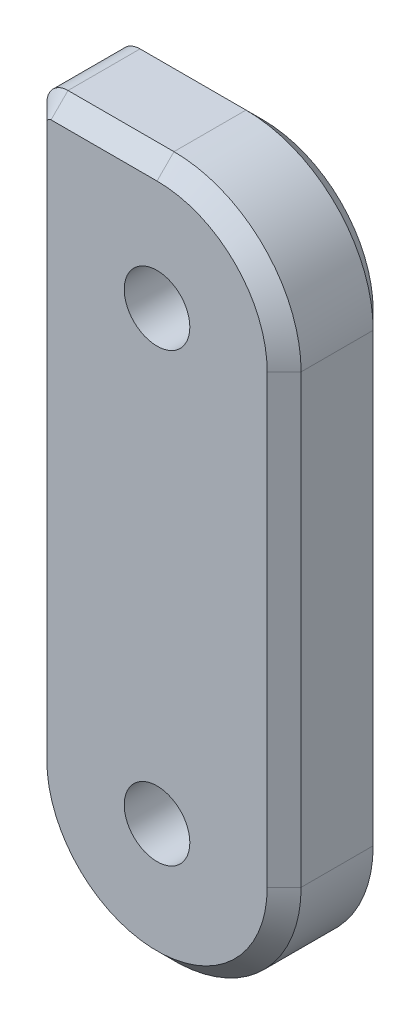
ISO-10303-21;
HEADER;
FILE_DESCRIPTION(('STEP AP214'),'2;1');
FILE_NAME('part.step','',(''),(''),'','','');
FILE_SCHEMA(('AUTOMOTIVE_DESIGN { 1 0 10303 214 1 1 1 1 }'));
ENDSEC;
DATA;
#1=APPLICATION_CONTEXT('core data for automotive mechanical design processes');
#2=APPLICATION_PROTOCOL_DEFINITION('international standard','automotive_design',2000,#1);
#3=PRODUCT_CONTEXT('',#1,'mechanical');
#4=PRODUCT('Part','Part','',(#3));
#5=PRODUCT_RELATED_PRODUCT_CATEGORY('part','',(#4));
#6=PRODUCT_DEFINITION_FORMATION('','',#4);
#7=PRODUCT_DEFINITION_CONTEXT('part definition',#1,'design');
#8=PRODUCT_DEFINITION('design','',#6,#7);
#9=PRODUCT_DEFINITION_SHAPE('','',#8);
#10=(LENGTH_UNIT() NAMED_UNIT(*) SI_UNIT(.MILLI.,.METRE.));
#11=(NAMED_UNIT(*) PLANE_ANGLE_UNIT() SI_UNIT($,.RADIAN.));
#12=(NAMED_UNIT(*) SI_UNIT($,.STERADIAN.) SOLID_ANGLE_UNIT());
#13=UNCERTAINTY_MEASURE_WITH_UNIT(LENGTH_MEASURE(1.E-05),#10,'distance_accuracy_value','');
#14=(GEOMETRIC_REPRESENTATION_CONTEXT(3) GLOBAL_UNCERTAINTY_ASSIGNED_CONTEXT((#13)) GLOBAL_UNIT_ASSIGNED_CONTEXT((#10,
#11,#12)) REPRESENTATION_CONTEXT('',''));
#15=CARTESIAN_POINT('',(0.,0.,0.));
#16=DIRECTION('',(0.,0.,1.));
#17=DIRECTION('',(1.,0.,0.));
#18=AXIS2_PLACEMENT_3D('',#15,#16,#17);
#19=CARTESIAN_POINT('',(0.,33.44418,7.9375));
#20=DIRECTION('',(0.,0.,1.));
#21=DIRECTION('',(1.,0.,0.));
#22=AXIS2_PLACEMENT_3D('',#19,#20,#21);
#23=CYLINDRICAL_SURFACE('',#22,2.45744999999999);
#24=CARTESIAN_POINT('',(0.,33.44418,7.9375));
#25=DIRECTION('',(0.,0.,1.));
#26=DIRECTION('',(1.,0.,0.));
#27=AXIS2_PLACEMENT_3D('',#24,#25,#26);
#28=CIRCLE('',#27,2.45744999999999);
#29=CARTESIAN_POINT('',(2.45744999999999,33.44418,7.9375));
#30=VERTEX_POINT('',#29);
#31=EDGE_CURVE('E213',#30,#30,#28,.T.);
#32=ORIENTED_EDGE('',*,*,#31,.T.);
#33=EDGE_LOOP('',(#32));
#34=FACE_BOUND('',#33,.T.);
#35=CARTESIAN_POINT('',(0.,33.44418,2.032));
#36=DIRECTION('',(0.,0.,-1.));
#37=DIRECTION('',(-1.,0.,0.));
#38=AXIS2_PLACEMENT_3D('',#35,#36,#37);
#39=CIRCLE('',#38,2.45744999999999);
#40=CARTESIAN_POINT('',(-2.45744999999999,33.44418,2.032));
#41=VERTEX_POINT('',#40);
#42=EDGE_CURVE('E210',#41,#41,#39,.F.);
#43=ORIENTED_EDGE('',*,*,#42,.F.);
#44=EDGE_LOOP('',(#43));
#45=FACE_BOUND('',#44,.T.);
#46=ADVANCED_FACE('F33',(#34,#45),#23,.F.);
#47=CARTESIAN_POINT('',(0.,0.,7.9375));
#48=DIRECTION('',(0.,0.,-1.));
#49=DIRECTION('',(-1.,0.,0.));
#50=AXIS2_PLACEMENT_3D('',#47,#48,#49);
#51=CYLINDRICAL_SURFACE('',#50,9.525);
#52=DIRECTION('',(0.,0.,-1.));
#53=VECTOR('',#52,1.);
#54=CARTESIAN_POINT('',(-9.525,0.,7.9375));
#55=LINE('',#54,#53);
#56=CARTESIAN_POINT('',(-9.525,0.,6.6675));
#57=VERTEX_POINT('',#56);
#58=CARTESIAN_POINT('',(-9.525,0.,1.27000000000001));
#59=VERTEX_POINT('',#58);
#60=EDGE_CURVE('E149',#57,#59,#55,.T.);
#61=ORIENTED_EDGE('',*,*,#60,.T.);
#62=CARTESIAN_POINT('',(0.,0.,1.27000000000001));
#63=DIRECTION('',(0.,0.,1.));
#64=DIRECTION('',(1.,0.,0.));
#65=AXIS2_PLACEMENT_3D('',#62,#63,#64);
#66=CIRCLE('',#65,9.525);
#67=CARTESIAN_POINT('',(9.525,0.,1.27000000000001));
#68=VERTEX_POINT('',#67);
#69=EDGE_CURVE('E258',#59,#68,#66,.T.);
#70=ORIENTED_EDGE('',*,*,#69,.T.);
#71=DIRECTION('',(0.,0.,-1.));
#72=VECTOR('',#71,1.);
#73=CARTESIAN_POINT('',(9.525,0.,7.9375));
#74=LINE('',#73,#72);
#75=CARTESIAN_POINT('',(9.525,0.,6.6675));
#76=VERTEX_POINT('',#75);
#77=EDGE_CURVE('E225',#76,#68,#74,.T.);
#78=ORIENTED_EDGE('',*,*,#77,.F.);
#79=CARTESIAN_POINT('',(0.,0.,6.6675));
#80=DIRECTION('',(0.,0.,1.));
#81=DIRECTION('',(1.,0.,0.));
#82=AXIS2_PLACEMENT_3D('',#79,#80,#81);
#83=CIRCLE('',#82,9.525);
#84=EDGE_CURVE('E256',#76,#57,#83,.F.);
#85=ORIENTED_EDGE('',*,*,#84,.T.);
#86=EDGE_LOOP('',(#61,#70,#78,#85));
#87=FACE_BOUND('',#86,.T.);
#88=ADVANCED_FACE('F290',(#87),#51,.T.);
#89=CARTESIAN_POINT('',(9.525,33.44418,7.9375));
#90=DIRECTION('',(-1.,0.,0.));
#91=DIRECTION('',(0.,0.,1.));
#92=AXIS2_PLACEMENT_3D('',#89,#90,#91);
#93=PLANE('',#92);
#94=ORIENTED_EDGE('',*,*,#77,.T.);
#95=DIRECTION('',(0.,1.,0.));
#96=VECTOR('',#95,1.);
#97=CARTESIAN_POINT('',(9.525,33.44418,1.27000000000001));
#98=LINE('',#97,#96);
#99=CARTESIAN_POINT('',(9.525,33.44418,1.27000000000001));
#100=VERTEX_POINT('',#99);
#101=EDGE_CURVE('E250',#68,#100,#98,.T.);
#102=ORIENTED_EDGE('',*,*,#101,.T.);
#103=DIRECTION('',(0.,0.,-1.));
#104=VECTOR('',#103,1.);
#105=CARTESIAN_POINT('',(9.525,33.44418,7.9375));
#106=LINE('',#105,#104);
#107=CARTESIAN_POINT('',(9.525,33.44418,6.6675));
#108=VERTEX_POINT('',#107);
#109=EDGE_CURVE('E148',#108,#100,#106,.T.);
#110=ORIENTED_EDGE('',*,*,#109,.F.);
#111=DIRECTION('',(0.,-1.,0.));
#112=VECTOR('',#111,1.);
#113=CARTESIAN_POINT('',(9.525,0.,6.6675));
#114=LINE('',#113,#112);
#115=EDGE_CURVE('E248',#108,#76,#114,.T.);
#116=ORIENTED_EDGE('',*,*,#115,.T.);
#117=EDGE_LOOP('',(#94,#102,#110,#116));
#118=FACE_BOUND('',#117,.T.);
#119=ADVANCED_FACE('F287',(#118),#93,.F.);
#120=CARTESIAN_POINT('',(0.,33.44418,7.9375));
#121=DIRECTION('',(0.,0.,-1.));
#122=DIRECTION('',(-1.,0.,0.));
#123=AXIS2_PLACEMENT_3D('',#120,#121,#122);
#124=CYLINDRICAL_SURFACE('',#123,9.525);
#125=ORIENTED_EDGE('',*,*,#109,.T.);
#126=CARTESIAN_POINT('',(0.,33.44418,1.27000000000001));
#127=DIRECTION('',(0.,0.,1.));
#128=DIRECTION('',(1.,0.,0.));
#129=AXIS2_PLACEMENT_3D('',#126,#127,#128);
#130=CIRCLE('',#129,9.525);
#131=CARTESIAN_POINT('',(0.,42.96918,1.27000000000001));
#132=VERTEX_POINT('',#131);
#133=EDGE_CURVE('E147',#100,#132,#130,.T.);
#134=ORIENTED_EDGE('',*,*,#133,.T.);
#135=DIRECTION('',(0.,0.,-1.));
#136=VECTOR('',#135,1.);
#137=CARTESIAN_POINT('',(0.,42.96918,7.9375));
#138=LINE('',#137,#136);
#139=CARTESIAN_POINT('',(0.,42.96918,6.6675));
#140=VERTEX_POINT('',#139);
#141=EDGE_CURVE('E130',#140,#132,#138,.T.);
#142=ORIENTED_EDGE('',*,*,#141,.F.);
#143=CARTESIAN_POINT('',(0.,33.44418,6.6675));
#144=DIRECTION('',(0.,0.,1.));
#145=DIRECTION('',(1.,0.,0.));
#146=AXIS2_PLACEMENT_3D('',#143,#144,#145);
#147=CIRCLE('',#146,9.525);
#148=EDGE_CURVE('E144',#140,#108,#147,.F.);
#149=ORIENTED_EDGE('',*,*,#148,.T.);
#150=EDGE_LOOP('',(#125,#134,#142,#149));
#151=FACE_BOUND('',#150,.T.);
#152=ADVANCED_FACE('F143',(#151),#124,.T.);
#153=CARTESIAN_POINT('',(-9.525,42.96918,7.9375));
#154=DIRECTION('',(0.,-1.,0.));
#155=DIRECTION('',(0.,0.,-1.));
#156=AXIS2_PLACEMENT_3D('',#153,#154,#155);
#157=PLANE('',#156);
#158=ORIENTED_EDGE('',*,*,#141,.T.);
#159=DIRECTION('',(-1.,0.,0.));
#160=VECTOR('',#159,1.);
#161=CARTESIAN_POINT('',(-9.525,42.96918,1.27000000000001));
#162=LINE('',#161,#160);
#163=CARTESIAN_POINT('',(-7.9375,42.96918,1.27000000000001));
#164=VERTEX_POINT('',#163);
#165=EDGE_CURVE('E136',#132,#164,#162,.T.);
#166=ORIENTED_EDGE('',*,*,#165,.T.);
#167=DIRECTION('',(0.,0.,-1.));
#168=VECTOR('',#167,1.);
#169=CARTESIAN_POINT('',(-7.9375,42.96918,7.9375));
#170=LINE('',#169,#168);
#171=CARTESIAN_POINT('',(-7.9375,42.96918,6.6675));
#172=VERTEX_POINT('',#171);
#173=EDGE_CURVE('E132',#164,#172,#170,.F.);
#174=ORIENTED_EDGE('',*,*,#173,.T.);
#175=DIRECTION('',(1.,0.,0.));
#176=VECTOR('',#175,1.);
#177=CARTESIAN_POINT('',(0.,42.96918,6.6675));
#178=LINE('',#177,#176);
#179=EDGE_CURVE('E127',#172,#140,#178,.T.);
#180=ORIENTED_EDGE('',*,*,#179,.T.);
#181=EDGE_LOOP('',(#158,#166,#174,#180));
#182=FACE_BOUND('',#181,.T.);
#183=ADVANCED_FACE('F129',(#182),#157,.F.);
#184=CARTESIAN_POINT('',(-9.525,42.96918,7.9375));
#185=DIRECTION('',(1.,0.,0.));
#186=DIRECTION('',(0.,0.,-1.));
#187=AXIS2_PLACEMENT_3D('',#184,#185,#186);
#188=PLANE('',#187);
#189=DIRECTION('',(0.,0.,-1.));
#190=VECTOR('',#189,1.);
#191=CARTESIAN_POINT('',(-9.525,41.38168,7.9375));
#192=LINE('',#191,#190);
#193=CARTESIAN_POINT('',(-9.525,41.38168,6.6675));
#194=VERTEX_POINT('',#193);
#195=CARTESIAN_POINT('',(-9.525,41.38168,1.27000000000001));
#196=VERTEX_POINT('',#195);
#197=EDGE_CURVE('E228',#194,#196,#192,.T.);
#198=ORIENTED_EDGE('',*,*,#197,.T.);
#199=DIRECTION('',(0.,-1.,0.));
#200=VECTOR('',#199,1.);
#201=CARTESIAN_POINT('',(-9.525,42.96918,1.27000000000001));
#202=LINE('',#201,#200);
#203=EDGE_CURVE('E262',#196,#59,#202,.T.);
#204=ORIENTED_EDGE('',*,*,#203,.T.);
#205=ORIENTED_EDGE('',*,*,#60,.F.);
#206=DIRECTION('',(0.,1.,0.));
#207=VECTOR('',#206,1.);
#208=CARTESIAN_POINT('',(-9.525,41.38168,6.6675));
#209=LINE('',#208,#207);
#210=EDGE_CURVE('E260',#57,#194,#209,.T.);
#211=ORIENTED_EDGE('',*,*,#210,.T.);
#212=EDGE_LOOP('',(#198,#204,#205,#211));
#213=FACE_BOUND('',#212,.T.);
#214=ADVANCED_FACE('F329',(#213),#188,.F.);
#215=CARTESIAN_POINT('',(0.,0.,7.9375));
#216=DIRECTION('',(0.,0.,1.));
#217=DIRECTION('',(1.,0.,0.));
#218=AXIS2_PLACEMENT_3D('',#215,#216,#217);
#219=PLANE('',#218);
#220=DIRECTION('',(0.,1.,0.));
#221=VECTOR('',#220,1.);
#222=CARTESIAN_POINT('',(8.25500000000001,33.44418,7.9375));
#223=LINE('',#222,#221);
#224=CARTESIAN_POINT('',(8.25500000000001,0.,7.9375));
#225=VERTEX_POINT('',#224);
#226=CARTESIAN_POINT('',(8.25500000000001,33.44418,7.9375));
#227=VERTEX_POINT('',#226);
#228=EDGE_CURVE('E57',#225,#227,#223,.T.);
#229=ORIENTED_EDGE('',*,*,#228,.T.);
#230=CARTESIAN_POINT('',(0.,33.44418,7.9375));
#231=DIRECTION('',(0.,0.,1.));
#232=DIRECTION('',(1.,0.,0.));
#233=AXIS2_PLACEMENT_3D('',#230,#231,#232);
#234=CIRCLE('',#233,8.25500000000001);
#235=CARTESIAN_POINT('',(0.,41.69918,7.9375));
#236=VERTEX_POINT('',#235);
#237=EDGE_CURVE('E11',#227,#236,#234,.T.);
#238=ORIENTED_EDGE('',*,*,#237,.T.);
#239=DIRECTION('',(-1.,0.,0.));
#240=VECTOR('',#239,1.);
#241=CARTESIAN_POINT('',(-7.9375,41.69918,7.9375));
#242=LINE('',#241,#240);
#243=CARTESIAN_POINT('',(-7.9375,41.69918,7.9375));
#244=VERTEX_POINT('',#243);
#245=EDGE_CURVE('E42',#236,#244,#242,.T.);
#246=ORIENTED_EDGE('',*,*,#245,.T.);
#247=CARTESIAN_POINT('',(-7.9375,41.38168,7.9375));
#248=DIRECTION('',(0.,0.,1.));
#249=DIRECTION('',(1.,0.,0.));
#250=AXIS2_PLACEMENT_3D('',#247,#248,#249);
#251=CIRCLE('',#250,0.317500000000005);
#252=CARTESIAN_POINT('',(-8.25500000000001,41.38168,7.9375));
#253=VERTEX_POINT('',#252);
#254=EDGE_CURVE('E268',#244,#253,#251,.T.);
#255=ORIENTED_EDGE('',*,*,#254,.T.);
#256=DIRECTION('',(0.,-1.,0.));
#257=VECTOR('',#256,1.);
#258=CARTESIAN_POINT('',(-8.25500000000001,0.,7.9375));
#259=LINE('',#258,#257);
#260=CARTESIAN_POINT('',(-8.25500000000001,0.,7.9375));
#261=VERTEX_POINT('',#260);
#262=EDGE_CURVE('E264',#253,#261,#259,.T.);
#263=ORIENTED_EDGE('',*,*,#262,.T.);
#264=CARTESIAN_POINT('',(0.,0.,7.9375));
#265=DIRECTION('',(0.,0.,1.));
#266=DIRECTION('',(1.,0.,0.));
#267=AXIS2_PLACEMENT_3D('',#264,#265,#266);
#268=CIRCLE('',#267,8.25500000000001);
#269=EDGE_CURVE('E266',#261,#225,#268,.T.);
#270=ORIENTED_EDGE('',*,*,#269,.T.);
#271=EDGE_LOOP('',(#229,#238,#246,#255,#263,#270));
#272=FACE_BOUND('',#271,.T.);
#273=ORIENTED_EDGE('',*,*,#31,.F.);
#274=EDGE_LOOP('',(#273));
#275=FACE_BOUND('',#274,.T.);
#276=CARTESIAN_POINT('',(0.,0.,7.9375));
#277=DIRECTION('',(0.,0.,1.));
#278=DIRECTION('',(1.,0.,0.));
#279=AXIS2_PLACEMENT_3D('',#276,#277,#278);
#280=CIRCLE('',#279,2.45744999999999);
#281=CARTESIAN_POINT('',(2.45745000000004,0.,7.9375));
#282=VERTEX_POINT('',#281);
#283=EDGE_CURVE('E216',#282,#282,#280,.T.);
#284=ORIENTED_EDGE('',*,*,#283,.F.);
#285=EDGE_LOOP('',(#284));
#286=FACE_BOUND('',#285,.T.);
#287=ADVANCED_FACE('F270',(#272,#275,#286),#219,.T.);
#288=CARTESIAN_POINT('',(0.,0.,0.));
#289=DIRECTION('',(0.,0.,1.));
#290=DIRECTION('',(1.,0.,0.));
#291=AXIS2_PLACEMENT_3D('',#288,#289,#290);
#292=PLANE('',#291);
#293=DIRECTION('',(1.,0.,0.));
#294=VECTOR('',#293,1.);
#295=CARTESIAN_POINT('',(0.,41.69918,0.));
#296=LINE('',#295,#294);
#297=CARTESIAN_POINT('',(-7.9375,41.69918,0.));
#298=VERTEX_POINT('',#297);
#299=CARTESIAN_POINT('',(0.,41.69918,0.));
#300=VERTEX_POINT('',#299);
#301=EDGE_CURVE('E243',#298,#300,#296,.T.);
#302=ORIENTED_EDGE('',*,*,#301,.T.);
#303=CARTESIAN_POINT('',(0.,33.44418,0.));
#304=DIRECTION('',(0.,0.,1.));
#305=DIRECTION('',(1.,0.,0.));
#306=AXIS2_PLACEMENT_3D('',#303,#304,#305);
#307=CIRCLE('',#306,8.25499999999999);
#308=CARTESIAN_POINT('',(8.255,33.44418,0.));
#309=VERTEX_POINT('',#308);
#310=EDGE_CURVE('E137',#300,#309,#307,.F.);
#311=ORIENTED_EDGE('',*,*,#310,.T.);
#312=DIRECTION('',(0.,-1.,0.));
#313=VECTOR('',#312,1.);
#314=CARTESIAN_POINT('',(8.255,0.,0.));
#315=LINE('',#314,#313);
#316=CARTESIAN_POINT('',(8.255,0.,0.));
#317=VERTEX_POINT('',#316);
#318=EDGE_CURVE('E241',#309,#317,#315,.T.);
#319=ORIENTED_EDGE('',*,*,#318,.T.);
#320=CARTESIAN_POINT('',(0.,0.,0.));
#321=DIRECTION('',(0.,0.,1.));
#322=DIRECTION('',(1.,0.,0.));
#323=AXIS2_PLACEMENT_3D('',#320,#321,#322);
#324=CIRCLE('',#323,8.255);
#325=CARTESIAN_POINT('',(-8.255,0.,0.));
#326=VERTEX_POINT('',#325);
#327=EDGE_CURVE('E237',#317,#326,#324,.F.);
#328=ORIENTED_EDGE('',*,*,#327,.T.);
#329=DIRECTION('',(0.,1.,0.));
#330=VECTOR('',#329,1.);
#331=CARTESIAN_POINT('',(-8.255,0.,0.));
#332=LINE('',#331,#330);
#333=CARTESIAN_POINT('',(-8.255,41.38168,0.));
#334=VERTEX_POINT('',#333);
#335=EDGE_CURVE('E235',#326,#334,#332,.T.);
#336=ORIENTED_EDGE('',*,*,#335,.T.);
#337=CARTESIAN_POINT('',(-7.9375,41.38168,0.));
#338=DIRECTION('',(0.,0.,1.));
#339=DIRECTION('',(1.,0.,0.));
#340=AXIS2_PLACEMENT_3D('',#337,#338,#339);
#341=CIRCLE('',#340,0.317499999999991);
#342=EDGE_CURVE('E239',#334,#298,#341,.F.);
#343=ORIENTED_EDGE('',*,*,#342,.T.);
#344=EDGE_LOOP('',(#302,#311,#319,#328,#336,#343));
#345=FACE_BOUND('',#344,.T.);
#346=CARTESIAN_POINT('',(0.,33.44418,0.));
#347=DIRECTION('',(0.,0.,-1.));
#348=DIRECTION('',(-1.,0.,0.));
#349=AXIS2_PLACEMENT_3D('',#346,#347,#348);
#350=CIRCLE('',#349,5.08);
#351=CARTESIAN_POINT('',(-5.08,33.44418,0.));
#352=VERTEX_POINT('',#351);
#353=EDGE_CURVE('E199',#352,#352,#350,.T.);
#354=ORIENTED_EDGE('',*,*,#353,.F.);
#355=EDGE_LOOP('',(#354));
#356=FACE_BOUND('',#355,.T.);
#357=CARTESIAN_POINT('',(0.,0.,0.));
#358=DIRECTION('',(0.,0.,1.));
#359=DIRECTION('',(1.,0.,0.));
#360=AXIS2_PLACEMENT_3D('',#357,#358,#359);
#361=CIRCLE('',#360,2.45744999999999);
#362=CARTESIAN_POINT('',(2.45745000000005,0.,0.));
#363=VERTEX_POINT('',#362);
#364=EDGE_CURVE('E219',#363,#363,#361,.T.);
#365=ORIENTED_EDGE('',*,*,#364,.T.);
#366=EDGE_LOOP('',(#365));
#367=FACE_BOUND('',#366,.T.);
#368=ADVANCED_FACE('F325',(#345,#356,#367),#292,.F.);
#369=CARTESIAN_POINT('',(0.,0.,7.9375));
#370=DIRECTION('',(0.,0.,1.));
#371=DIRECTION('',(1.,0.,0.));
#372=AXIS2_PLACEMENT_3D('',#369,#370,#371);
#373=CYLINDRICAL_SURFACE('',#372,2.45744999999999);
#374=ORIENTED_EDGE('',*,*,#364,.F.);
#375=EDGE_LOOP('',(#374));
#376=FACE_BOUND('',#375,.T.);
#377=ORIENTED_EDGE('',*,*,#283,.T.);
#378=EDGE_LOOP('',(#377));
#379=FACE_BOUND('',#378,.T.);
#380=ADVANCED_FACE('F321',(#376,#379),#373,.F.);
#381=CARTESIAN_POINT('',(0.,33.44418,2.032));
#382=DIRECTION('',(0.,0.,-1.));
#383=DIRECTION('',(-1.,0.,0.));
#384=AXIS2_PLACEMENT_3D('',#381,#382,#383);
#385=PLANE('',#384);
#386=CARTESIAN_POINT('',(0.,33.44418,2.032));
#387=DIRECTION('',(0.,0.,-1.));
#388=DIRECTION('',(-1.,0.,0.));
#389=AXIS2_PLACEMENT_3D('',#386,#387,#388);
#390=CIRCLE('',#389,5.08);
#391=CARTESIAN_POINT('',(-5.08,33.44418,2.032));
#392=VERTEX_POINT('',#391);
#393=EDGE_CURVE('E205',#392,#392,#390,.T.);
#394=ORIENTED_EDGE('',*,*,#393,.T.);
#395=EDGE_LOOP('',(#394));
#396=FACE_BOUND('',#395,.T.);
#397=ORIENTED_EDGE('',*,*,#42,.T.);
#398=EDGE_LOOP('',(#397));
#399=FACE_BOUND('',#398,.T.);
#400=ADVANCED_FACE('F324',(#396,#399),#385,.T.);
#401=CARTESIAN_POINT('',(0.,33.44418,2.032));
#402=DIRECTION('',(0.,0.,-1.));
#403=DIRECTION('',(-1.,0.,0.));
#404=AXIS2_PLACEMENT_3D('',#401,#402,#403);
#405=CYLINDRICAL_SURFACE('',#404,5.08);
#406=ORIENTED_EDGE('',*,*,#393,.F.);
#407=EDGE_LOOP('',(#406));
#408=FACE_BOUND('',#407,.T.);
#409=ORIENTED_EDGE('',*,*,#353,.T.);
#410=EDGE_LOOP('',(#409));
#411=FACE_BOUND('',#410,.T.);
#412=ADVANCED_FACE('F319',(#408,#411),#405,.F.);
#413=CARTESIAN_POINT('',(-7.9375,41.38168,7.9375));
#414=DIRECTION('',(0.,0.,-1.));
#415=DIRECTION('',(-1.,0.,0.));
#416=AXIS2_PLACEMENT_3D('',#413,#414,#415);
#417=CYLINDRICAL_SURFACE('',#416,1.5875);
#418=ORIENTED_EDGE('',*,*,#173,.F.);
#419=CARTESIAN_POINT('',(-7.9375,41.38168,1.27000000000001));
#420=DIRECTION('',(0.,0.,1.));
#421=DIRECTION('',(1.,0.,0.));
#422=AXIS2_PLACEMENT_3D('',#419,#420,#421);
#423=CIRCLE('',#422,1.5875);
#424=EDGE_CURVE('E254',#164,#196,#423,.T.);
#425=ORIENTED_EDGE('',*,*,#424,.T.);
#426=ORIENTED_EDGE('',*,*,#197,.F.);
#427=CARTESIAN_POINT('',(-7.9375,41.38168,6.6675));
#428=DIRECTION('',(0.,0.,1.));
#429=DIRECTION('',(1.,0.,0.));
#430=AXIS2_PLACEMENT_3D('',#427,#428,#429);
#431=CIRCLE('',#430,1.5875);
#432=EDGE_CURVE('E252',#194,#172,#431,.F.);
#433=ORIENTED_EDGE('',*,*,#432,.T.);
#434=EDGE_LOOP('',(#418,#425,#426,#433));
#435=FACE_BOUND('',#434,.T.);
#436=ADVANCED_FACE('F276',(#435),#417,.T.);
#437=CARTESIAN_POINT('',(-9.525,42.96918,1.27000000000001));
#438=DIRECTION('',(0.707106781186547,0.,0.707106781186547));
#439=DIRECTION('',(0.,-1.,0.));
#440=AXIS2_PLACEMENT_3D('',#437,#438,#439);
#441=PLANE('',#440);
#442=DIRECTION('',(-0.707106781186547,0.,0.707106781186547));
#443=VECTOR('',#442,1.);
#444=CARTESIAN_POINT('',(-8.255,41.38168,0.));
#445=LINE('',#444,#443);
#446=EDGE_CURVE('E192',#334,#196,#445,.T.);
#447=ORIENTED_EDGE('',*,*,#446,.F.);
#448=ORIENTED_EDGE('',*,*,#335,.F.);
#449=DIRECTION('',(0.707106781186547,0.,-0.707106781186547));
#450=VECTOR('',#449,1.);
#451=CARTESIAN_POINT('',(-9.525,0.,1.27000000000001));
#452=LINE('',#451,#450);
#453=EDGE_CURVE('E160',#59,#326,#452,.T.);
#454=ORIENTED_EDGE('',*,*,#453,.F.);
#455=ORIENTED_EDGE('',*,*,#203,.F.);
#456=EDGE_LOOP('',(#447,#448,#454,#455));
#457=FACE_BOUND('',#456,.T.);
#458=ADVANCED_FACE('F341',(#457),#441,.F.);
#459=CARTESIAN_POINT('',(0.,0.,1.27000000000001));
#460=DIRECTION('',(0.,0.,1.));
#461=DIRECTION('',(1.,0.,0.));
#462=AXIS2_PLACEMENT_3D('',#459,#460,#461);
#463=CONICAL_SURFACE('',#462,9.525,0.785398163397448);
#464=ORIENTED_EDGE('',*,*,#453,.T.);
#465=ORIENTED_EDGE('',*,*,#327,.F.);
#466=DIRECTION('',(-0.707106781186547,0.,-0.707106781186547));
#467=VECTOR('',#466,1.);
#468=CARTESIAN_POINT('',(9.525,0.,1.27000000000001));
#469=LINE('',#468,#467);
#470=EDGE_CURVE('E190',#68,#317,#469,.T.);
#471=ORIENTED_EDGE('',*,*,#470,.F.);
#472=ORIENTED_EDGE('',*,*,#69,.F.);
#473=EDGE_LOOP('',(#464,#465,#471,#472));
#474=FACE_BOUND('',#473,.T.);
#475=ADVANCED_FACE('F292',(#474),#463,.T.);
#476=CARTESIAN_POINT('',(-7.9375,41.38168,0.));
#477=DIRECTION('',(0.,0.,1.));
#478=DIRECTION('',(1.,0.,0.));
#479=AXIS2_PLACEMENT_3D('',#476,#477,#478);
#480=CONICAL_SURFACE('',#479,0.317499999999991,0.785398163397449);
#481=ORIENTED_EDGE('',*,*,#446,.T.);
#482=ORIENTED_EDGE('',*,*,#424,.F.);
#483=DIRECTION('',(0.,0.707106781186547,0.707106781186547));
#484=VECTOR('',#483,1.);
#485=CARTESIAN_POINT('',(-7.9375,41.69918,0.));
#486=LINE('',#485,#484);
#487=EDGE_CURVE('E184',#298,#164,#486,.T.);
#488=ORIENTED_EDGE('',*,*,#487,.F.);
#489=ORIENTED_EDGE('',*,*,#342,.F.);
#490=EDGE_LOOP('',(#481,#482,#488,#489));
#491=FACE_BOUND('',#490,.T.);
#492=ADVANCED_FACE('F416',(#491),#480,.T.);
#493=CARTESIAN_POINT('',(9.525,33.44418,1.27000000000001));
#494=DIRECTION('',(-0.707106781186547,0.,0.707106781186547));
#495=DIRECTION('',(0.,1.,0.));
#496=AXIS2_PLACEMENT_3D('',#493,#494,#495);
#497=PLANE('',#496);
#498=ORIENTED_EDGE('',*,*,#470,.T.);
#499=ORIENTED_EDGE('',*,*,#318,.F.);
#500=DIRECTION('',(-0.707106781186547,0.,-0.707106781186547));
#501=VECTOR('',#500,1.);
#502=CARTESIAN_POINT('',(9.525,33.44418,1.27000000000001));
#503=LINE('',#502,#501);
#504=EDGE_CURVE('E178',#100,#309,#503,.T.);
#505=ORIENTED_EDGE('',*,*,#504,.F.);
#506=ORIENTED_EDGE('',*,*,#101,.F.);
#507=EDGE_LOOP('',(#498,#499,#505,#506));
#508=FACE_BOUND('',#507,.T.);
#509=ADVANCED_FACE('F297',(#508),#497,.F.);
#510=CARTESIAN_POINT('',(-9.525,42.96918,1.27000000000001));
#511=DIRECTION('',(0.,-0.707106781186547,0.707106781186547));
#512=DIRECTION('',(-1.,0.,0.));
#513=AXIS2_PLACEMENT_3D('',#510,#511,#512);
#514=PLANE('',#513);
#515=ORIENTED_EDGE('',*,*,#487,.T.);
#516=ORIENTED_EDGE('',*,*,#165,.F.);
#517=DIRECTION('',(0.,0.707106781186547,0.707106781186547));
#518=VECTOR('',#517,1.);
#519=CARTESIAN_POINT('',(0.,41.69918,0.));
#520=LINE('',#519,#518);
#521=EDGE_CURVE('E173',#300,#132,#520,.T.);
#522=ORIENTED_EDGE('',*,*,#521,.F.);
#523=ORIENTED_EDGE('',*,*,#301,.F.);
#524=EDGE_LOOP('',(#515,#516,#522,#523));
#525=FACE_BOUND('',#524,.T.);
#526=ADVANCED_FACE('F300',(#525),#514,.F.);
#527=CARTESIAN_POINT('',(0.,33.44418,1.27000000000001));
#528=DIRECTION('',(0.,0.,1.));
#529=DIRECTION('',(1.,0.,0.));
#530=AXIS2_PLACEMENT_3D('',#527,#528,#529);
#531=CONICAL_SURFACE('',#530,9.525,0.785398163397448);
#532=ORIENTED_EDGE('',*,*,#504,.T.);
#533=ORIENTED_EDGE('',*,*,#310,.F.);
#534=ORIENTED_EDGE('',*,*,#521,.T.);
#535=ORIENTED_EDGE('',*,*,#133,.F.);
#536=EDGE_LOOP('',(#532,#533,#534,#535));
#537=FACE_BOUND('',#536,.T.);
#538=ADVANCED_FACE('F298',(#537),#531,.T.);
#539=CARTESIAN_POINT('',(-8.25500000000001,0.,7.9375));
#540=DIRECTION('',(-0.707106781186549,0.,0.707106781186546));
#541=DIRECTION('',(0.,1.,0.));
#542=AXIS2_PLACEMENT_3D('',#539,#540,#541);
#543=PLANE('',#542);
#544=DIRECTION('',(0.707106781186546,0.,0.707106781186549));
#545=VECTOR('',#544,1.);
#546=CARTESIAN_POINT('',(-9.525,41.38168,6.6675));
#547=LINE('',#546,#545);
#548=EDGE_CURVE('E166',#194,#253,#547,.T.);
#549=ORIENTED_EDGE('',*,*,#548,.F.);
#550=ORIENTED_EDGE('',*,*,#210,.F.);
#551=DIRECTION('',(-0.707106781186546,0.,-0.707106781186549));
#552=VECTOR('',#551,1.);
#553=CARTESIAN_POINT('',(-8.25500000000001,0.,7.9375));
#554=LINE('',#553,#552);
#555=EDGE_CURVE('E37',#261,#57,#554,.T.);
#556=ORIENTED_EDGE('',*,*,#555,.F.);
#557=ORIENTED_EDGE('',*,*,#262,.F.);
#558=EDGE_LOOP('',(#549,#550,#556,#557));
#559=FACE_BOUND('',#558,.T.);
#560=ADVANCED_FACE('F35',(#559),#543,.T.);
#561=CARTESIAN_POINT('',(0.,0.,7.9375));
#562=DIRECTION('',(0.,0.,-1.));
#563=DIRECTION('',(-1.,0.,0.));
#564=AXIS2_PLACEMENT_3D('',#561,#562,#563);
#565=CONICAL_SURFACE('',#564,8.25500000000001,0.785398163397446);
#566=ORIENTED_EDGE('',*,*,#555,.T.);
#567=ORIENTED_EDGE('',*,*,#84,.F.);
#568=DIRECTION('',(0.707106781186546,0.,-0.707106781186549));
#569=VECTOR('',#568,1.);
#570=CARTESIAN_POINT('',(8.25500000000001,0.,7.9375));
#571=LINE('',#570,#569);
#572=EDGE_CURVE('E164',#225,#76,#571,.T.);
#573=ORIENTED_EDGE('',*,*,#572,.F.);
#574=ORIENTED_EDGE('',*,*,#269,.F.);
#575=EDGE_LOOP('',(#566,#567,#573,#574));
#576=FACE_BOUND('',#575,.T.);
#577=ADVANCED_FACE('F282',(#576),#565,.T.);
#578=CARTESIAN_POINT('',(-7.9375,41.38168,7.9375));
#579=DIRECTION('',(0.,0.,-1.));
#580=DIRECTION('',(-1.,0.,0.));
#581=AXIS2_PLACEMENT_3D('',#578,#579,#580);
#582=CONICAL_SURFACE('',#581,0.317500000000005,0.785398163397446);
#583=ORIENTED_EDGE('',*,*,#548,.T.);
#584=ORIENTED_EDGE('',*,*,#254,.F.);
#585=DIRECTION('',(0.,-0.707106781186546,0.707106781186549));
#586=VECTOR('',#585,1.);
#587=CARTESIAN_POINT('',(-7.9375,42.96918,6.6675));
#588=LINE('',#587,#586);
#589=EDGE_CURVE('E157',#172,#244,#588,.T.);
#590=ORIENTED_EDGE('',*,*,#589,.F.);
#591=ORIENTED_EDGE('',*,*,#432,.F.);
#592=EDGE_LOOP('',(#583,#584,#590,#591));
#593=FACE_BOUND('',#592,.T.);
#594=ADVANCED_FACE('F273',(#593),#582,.T.);
#595=CARTESIAN_POINT('',(8.25500000000001,0.,7.9375));
#596=DIRECTION('',(0.707106781186549,0.,0.707106781186546));
#597=DIRECTION('',(0.,-1.,0.));
#598=AXIS2_PLACEMENT_3D('',#595,#596,#597);
#599=PLANE('',#598);
#600=ORIENTED_EDGE('',*,*,#572,.T.);
#601=ORIENTED_EDGE('',*,*,#115,.F.);
#602=DIRECTION('',(0.707106781186546,0.,-0.707106781186549));
#603=VECTOR('',#602,1.);
#604=CARTESIAN_POINT('',(8.25500000000001,33.44418,7.9375));
#605=LINE('',#604,#603);
#606=EDGE_CURVE('E152',#227,#108,#605,.T.);
#607=ORIENTED_EDGE('',*,*,#606,.F.);
#608=ORIENTED_EDGE('',*,*,#228,.F.);
#609=EDGE_LOOP('',(#600,#601,#607,#608));
#610=FACE_BOUND('',#609,.T.);
#611=ADVANCED_FACE('F284',(#610),#599,.T.);
#612=CARTESIAN_POINT('',(0.,41.69918,7.9375));
#613=DIRECTION('',(0.,0.707106781186549,0.707106781186546));
#614=DIRECTION('',(1.,0.,0.));
#615=AXIS2_PLACEMENT_3D('',#612,#613,#614);
#616=PLANE('',#615);
#617=ORIENTED_EDGE('',*,*,#589,.T.);
#618=ORIENTED_EDGE('',*,*,#245,.F.);
#619=DIRECTION('',(0.,-0.707106781186546,0.707106781186549));
#620=VECTOR('',#619,1.);
#621=CARTESIAN_POINT('',(0.,42.96918,6.6675));
#622=LINE('',#621,#620);
#623=EDGE_CURVE('E50',#140,#236,#622,.T.);
#624=ORIENTED_EDGE('',*,*,#623,.F.);
#625=ORIENTED_EDGE('',*,*,#179,.F.);
#626=EDGE_LOOP('',(#617,#618,#624,#625));
#627=FACE_BOUND('',#626,.T.);
#628=ADVANCED_FACE('F155',(#627),#616,.T.);
#629=CARTESIAN_POINT('',(0.,33.44418,7.9375));
#630=DIRECTION('',(0.,0.,-1.));
#631=DIRECTION('',(-1.,0.,0.));
#632=AXIS2_PLACEMENT_3D('',#629,#630,#631);
#633=CONICAL_SURFACE('',#632,8.25500000000001,0.785398163397446);
#634=ORIENTED_EDGE('',*,*,#606,.T.);
#635=ORIENTED_EDGE('',*,*,#148,.F.);
#636=ORIENTED_EDGE('',*,*,#623,.T.);
#637=ORIENTED_EDGE('',*,*,#237,.F.);
#638=EDGE_LOOP('',(#634,#635,#636,#637));
#639=FACE_BOUND('',#638,.T.);
#640=ADVANCED_FACE('F151',(#639),#633,.T.);
#641=CLOSED_SHELL('',(#46,#88,#119,#152,#183,#214,#287,#368,#380,#400,#412,#436,#458,#475,#492,
#509,#526,#538,#560,#577,#594,#611,#628,#640));
#642=MANIFOLD_SOLID_BREP('B2',#641);
#643=ADVANCED_BREP_SHAPE_REPRESENTATION('',(#18,#642),#14);
#644=SHAPE_DEFINITION_REPRESENTATION(#9,#643);
ENDSEC;
END-ISO-10303-21;
